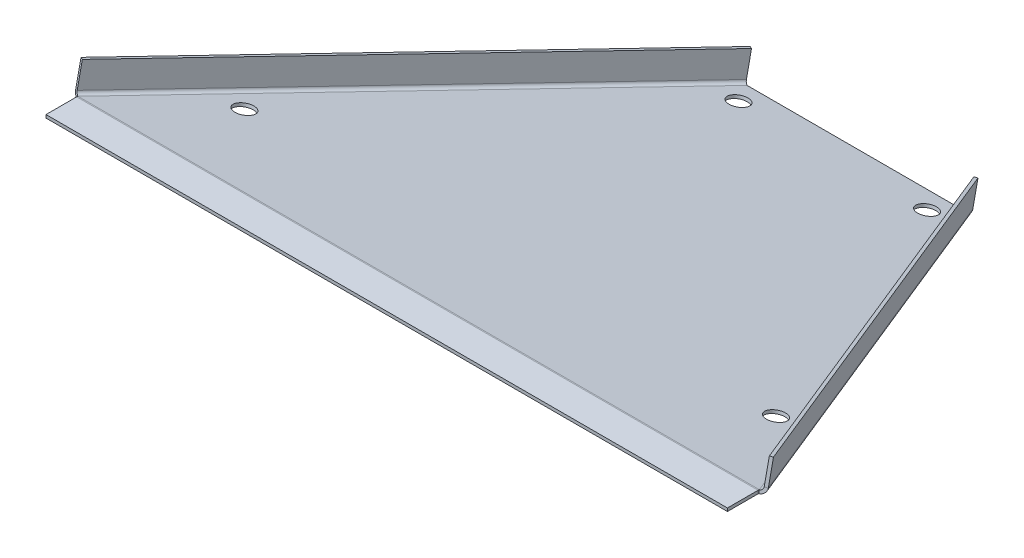
ISO-10303-21;
HEADER;
FILE_DESCRIPTION(('STEP AP214'),'2;1');
FILE_NAME('part.step','',(''),(''),'','','');
FILE_SCHEMA(('AUTOMOTIVE_DESIGN { 1 0 10303 214 1 1 1 1 }'));
ENDSEC;
DATA;
#1=APPLICATION_CONTEXT('core data for automotive mechanical design processes');
#2=APPLICATION_PROTOCOL_DEFINITION('international standard','automotive_design',2000,#1);
#3=PRODUCT_CONTEXT('',#1,'mechanical');
#4=PRODUCT('Part','Part','',(#3));
#5=PRODUCT_RELATED_PRODUCT_CATEGORY('part','',(#4));
#6=PRODUCT_DEFINITION_FORMATION('','',#4);
#7=PRODUCT_DEFINITION_CONTEXT('part definition',#1,'design');
#8=PRODUCT_DEFINITION('design','',#6,#7);
#9=PRODUCT_DEFINITION_SHAPE('','',#8);
#10=(LENGTH_UNIT() NAMED_UNIT(*) SI_UNIT(.MILLI.,.METRE.));
#11=(NAMED_UNIT(*) PLANE_ANGLE_UNIT() SI_UNIT($,.RADIAN.));
#12=(NAMED_UNIT(*) SI_UNIT($,.STERADIAN.) SOLID_ANGLE_UNIT());
#13=UNCERTAINTY_MEASURE_WITH_UNIT(LENGTH_MEASURE(1.E-05),#10,'distance_accuracy_value','');
#14=(GEOMETRIC_REPRESENTATION_CONTEXT(3) GLOBAL_UNCERTAINTY_ASSIGNED_CONTEXT((#13)) GLOBAL_UNIT_ASSIGNED_CONTEXT((#10,
#11,#12)) REPRESENTATION_CONTEXT('',''));
#15=CARTESIAN_POINT('',(0.,0.,0.));
#16=DIRECTION('',(0.,0.,1.));
#17=DIRECTION('',(1.,0.,0.));
#18=AXIS2_PLACEMENT_3D('',#15,#16,#17);
#19=CARTESIAN_POINT('',(-279.4,104.14,477.723454365452));
#20=DIRECTION('',(1.,0.,0.));
#21=DIRECTION('',(0.,0.,1.));
#22=AXIS2_PLACEMENT_3D('',#19,#20,#21);
#23=PLANE('',#22);
#24=DIRECTION('',(0.,1.,0.));
#25=VECTOR('',#24,1.);
#26=CARTESIAN_POINT('',(-279.4,104.14,478.257383880602));
#27=LINE('',#26,#25);
#28=CARTESIAN_POINT('',(-279.4,101.6,478.257383880602));
#29=VERTEX_POINT('',#28);
#30=CARTESIAN_POINT('',(-279.4,104.14,478.257383880602));
#31=VERTEX_POINT('',#30);
#32=EDGE_CURVE('E13',#29,#31,#27,.T.);
#33=ORIENTED_EDGE('',*,*,#32,.F.);
#34=DIRECTION('',(0.,0.,-1.));
#35=VECTOR('',#34,1.);
#36=CARTESIAN_POINT('',(-279.4,101.6,477.723454365452));
#37=LINE('',#36,#35);
#38=CARTESIAN_POINT('',(-279.4,101.6,503.390419123027));
#39=VERTEX_POINT('',#38);
#40=EDGE_CURVE('E131',#29,#39,#37,.F.);
#41=ORIENTED_EDGE('',*,*,#40,.T.);
#42=DIRECTION('',(0.,1.,0.));
#43=VECTOR('',#42,1.);
#44=CARTESIAN_POINT('',(-279.4,104.14,503.390419123027));
#45=LINE('',#44,#43);
#46=CARTESIAN_POINT('',(-279.4,104.14,503.390419123027));
#47=VERTEX_POINT('',#46);
#48=EDGE_CURVE('E88',#39,#47,#45,.T.);
#49=ORIENTED_EDGE('',*,*,#48,.T.);
#50=DIRECTION('',(0.,0.,1.));
#51=VECTOR('',#50,1.);
#52=CARTESIAN_POINT('',(-279.4,104.14,477.723454365452));
#53=LINE('',#52,#51);
#54=EDGE_CURVE('E133',#31,#47,#53,.T.);
#55=ORIENTED_EDGE('',*,*,#54,.F.);
#56=EDGE_LOOP('',(#33,#41,#49,#55));
#57=FACE_BOUND('',#56,.T.);
#58=ADVANCED_FACE('F79',(#57),#23,.F.);
#59=CARTESIAN_POINT('',(279.4,104.14,503.390419123027));
#60=DIRECTION('',(0.,0.,1.));
#61=DIRECTION('',(-1.,0.,0.));
#62=AXIS2_PLACEMENT_3D('',#59,#60,#61);
#63=PLANE('',#62);
#64=ORIENTED_EDGE('',*,*,#48,.F.);
#65=DIRECTION('',(1.,0.,0.));
#66=VECTOR('',#65,1.);
#67=CARTESIAN_POINT('',(279.4,101.6,503.390419123027));
#68=LINE('',#67,#66);
#69=CARTESIAN_POINT('',(279.4,101.6,503.390419123027));
#70=VERTEX_POINT('',#69);
#71=EDGE_CURVE('E158',#70,#39,#68,.F.);
#72=ORIENTED_EDGE('',*,*,#71,.F.);
#73=DIRECTION('',(0.,1.,0.));
#74=VECTOR('',#73,1.);
#75=CARTESIAN_POINT('',(279.4,104.14,503.390419123027));
#76=LINE('',#75,#74);
#77=CARTESIAN_POINT('',(279.4,104.14,503.390419123027));
#78=VERTEX_POINT('',#77);
#79=EDGE_CURVE('E174',#70,#78,#76,.T.);
#80=ORIENTED_EDGE('',*,*,#79,.T.);
#81=DIRECTION('',(-1.,0.,0.));
#82=VECTOR('',#81,1.);
#83=CARTESIAN_POINT('',(279.4,104.14,503.390419123027));
#84=LINE('',#83,#82);
#85=EDGE_CURVE('E315',#78,#47,#84,.T.);
#86=ORIENTED_EDGE('',*,*,#85,.T.);
#87=EDGE_LOOP('',(#64,#72,#80,#86));
#88=FACE_BOUND('',#87,.T.);
#89=ADVANCED_FACE('F336',(#88),#63,.T.);
#90=CARTESIAN_POINT('',(279.4,104.14,477.723454365452));
#91=DIRECTION('',(1.,0.,0.));
#92=DIRECTION('',(0.,0.,1.));
#93=AXIS2_PLACEMENT_3D('',#90,#91,#92);
#94=PLANE('',#93);
#95=ORIENTED_EDGE('',*,*,#79,.F.);
#96=DIRECTION('',(0.,0.,-1.));
#97=VECTOR('',#96,1.);
#98=CARTESIAN_POINT('',(279.4,101.6,477.723454365452));
#99=LINE('',#98,#97);
#100=CARTESIAN_POINT('',(279.4,101.6,478.257383880602));
#101=VERTEX_POINT('',#100);
#102=EDGE_CURVE('E333',#101,#70,#99,.F.);
#103=ORIENTED_EDGE('',*,*,#102,.F.);
#104=DIRECTION('',(0.,1.,0.));
#105=VECTOR('',#104,1.);
#106=CARTESIAN_POINT('',(279.4,104.14,478.257383880602));
#107=LINE('',#106,#105);
#108=CARTESIAN_POINT('',(279.4,104.14,478.257383880602));
#109=VERTEX_POINT('',#108);
#110=EDGE_CURVE('E105',#101,#109,#107,.T.);
#111=ORIENTED_EDGE('',*,*,#110,.T.);
#112=DIRECTION('',(0.,0.,1.));
#113=VECTOR('',#112,1.);
#114=CARTESIAN_POINT('',(279.4,104.14,477.723454365452));
#115=LINE('',#114,#113);
#116=EDGE_CURVE('E319',#109,#78,#115,.T.);
#117=ORIENTED_EDGE('',*,*,#116,.T.);
#118=EDGE_LOOP('',(#95,#103,#111,#117));
#119=FACE_BOUND('',#118,.T.);
#120=ADVANCED_FACE('F441',(#119),#94,.T.);
#121=CARTESIAN_POINT('',(279.4,99.0599999999999,478.257383880602));
#122=DIRECTION('',(-1.,0.,0.));
#123=DIRECTION('',(0.,0.,1.));
#124=AXIS2_PLACEMENT_3D('',#121,#122,#123);
#125=PLANE('',#124);
#126=ORIENTED_EDGE('',*,*,#110,.F.);
#127=CARTESIAN_POINT('',(279.4,99.0599999999999,478.257383880602));
#128=DIRECTION('',(-1.,0.,0.));
#129=DIRECTION('',(0.,0.,1.));
#130=AXIS2_PLACEMENT_3D('',#127,#128,#129);
#131=CIRCLE('',#130,2.54);
#132=CARTESIAN_POINT('',(279.4,101.544494905864,477.729288185925));
#133=VERTEX_POINT('',#132);
#134=EDGE_CURVE('E149',#101,#133,#131,.T.);
#135=ORIENTED_EDGE('',*,*,#134,.T.);
#136=DIRECTION('',(0.,0.978147600733807,-0.207911690817753));
#137=VECTOR('',#136,1.);
#138=CARTESIAN_POINT('',(279.4,104.028989811728,477.201192491248));
#139=LINE('',#138,#137);
#140=CARTESIAN_POINT('',(279.4,104.028989811728,477.201192491248));
#141=VERTEX_POINT('',#140);
#142=EDGE_CURVE('E170',#133,#141,#139,.T.);
#143=ORIENTED_EDGE('',*,*,#142,.T.);
#144=CARTESIAN_POINT('',(279.4,99.0599999999999,478.257383880602));
#145=DIRECTION('',(1.,0.,0.));
#146=DIRECTION('',(0.,0.,-1.));
#147=AXIS2_PLACEMENT_3D('',#144,#145,#146);
#148=CIRCLE('',#147,5.08);
#149=EDGE_CURVE('E316',#109,#141,#148,.F.);
#150=ORIENTED_EDGE('',*,*,#149,.F.);
#151=EDGE_LOOP('',(#126,#135,#143,#150));
#152=FACE_BOUND('',#151,.T.);
#153=ADVANCED_FACE('F446',(#152),#125,.F.);
#154=CARTESIAN_POINT('',(279.4,27.8844949058641,118.969509086081));
#155=DIRECTION('',(0.,0.207911690817753,0.978147600733807));
#156=DIRECTION('',(-1.,0.,0.));
#157=AXIS2_PLACEMENT_3D('',#154,#155,#156);
#158=PLANE('',#157);
#159=DIRECTION('',(0.,0.978147600733807,-0.207911690817753));
#160=VECTOR('',#159,1.);
#161=CARTESIAN_POINT('',(88.9,-52.6716373032427,136.092243569897));
#162=LINE('',#161,#160);
#163=CARTESIAN_POINT('',(88.9000000000001,25.4000000000033,119.49760478077));
#164=VERTEX_POINT('',#163);
#165=CARTESIAN_POINT('',(88.9,27.8844949058668,118.969509086093));
#166=VERTEX_POINT('',#165);
#167=EDGE_CURVE('E305',#164,#166,#162,.T.);
#168=ORIENTED_EDGE('',*,*,#167,.F.);
#169=DIRECTION('',(1.,0.,0.));
#170=VECTOR('',#169,1.);
#171=CARTESIAN_POINT('',(279.4,25.4000000000002,119.497604780758));
#172=LINE('',#171,#170);
#173=CARTESIAN_POINT('',(-88.8999999999998,25.4000000000002,119.497604780758));
#174=VERTEX_POINT('',#173);
#175=EDGE_CURVE('E153',#164,#174,#172,.F.);
#176=ORIENTED_EDGE('',*,*,#175,.T.);
#177=DIRECTION('',(0.,0.978147600733807,-0.207911690817753));
#178=VECTOR('',#177,1.);
#179=CARTESIAN_POINT('',(-88.9,-52.6716373032454,136.092243569884));
#180=LINE('',#179,#178);
#181=CARTESIAN_POINT('',(-88.9,27.8844949058641,118.969509086081));
#182=VERTEX_POINT('',#181);
#183=EDGE_CURVE('E306',#174,#182,#180,.T.);
#184=ORIENTED_EDGE('',*,*,#183,.T.);
#185=DIRECTION('',(-1.,0.,0.));
#186=VECTOR('',#185,1.);
#187=CARTESIAN_POINT('',(279.4,27.8844949058641,118.969509086081));
#188=LINE('',#187,#186);
#189=EDGE_CURVE('E321',#166,#182,#188,.T.);
#190=ORIENTED_EDGE('',*,*,#189,.F.);
#191=EDGE_LOOP('',(#168,#176,#184,#190));
#192=FACE_BOUND('',#191,.T.);
#193=ADVANCED_FACE('F449',(#192),#158,.F.);
#194=CARTESIAN_POINT('',(-279.4,99.0599999999999,478.257383880602));
#195=DIRECTION('',(1.,0.,0.));
#196=DIRECTION('',(0.,0.,-1.));
#197=AXIS2_PLACEMENT_3D('',#194,#195,#196);
#198=PLANE('',#197);
#199=CARTESIAN_POINT('',(-279.4,99.0599999999999,478.257383880602));
#200=DIRECTION('',(-1.,0.,0.));
#201=DIRECTION('',(0.,0.,1.));
#202=AXIS2_PLACEMENT_3D('',#199,#200,#201);
#203=CIRCLE('',#202,2.54);
#204=CARTESIAN_POINT('',(-279.4,101.544494905864,477.729288185925));
#205=VERTEX_POINT('',#204);
#206=EDGE_CURVE('E147',#205,#29,#203,.F.);
#207=ORIENTED_EDGE('',*,*,#206,.T.);
#208=ORIENTED_EDGE('',*,*,#32,.T.);
#209=CARTESIAN_POINT('',(-279.4,99.0599999999999,478.257383880602));
#210=DIRECTION('',(-1.,0.,0.));
#211=DIRECTION('',(0.,0.,1.));
#212=AXIS2_PLACEMENT_3D('',#209,#210,#211);
#213=CIRCLE('',#212,5.08);
#214=CARTESIAN_POINT('',(-279.4,104.028989811728,477.201192491248));
#215=VERTEX_POINT('',#214);
#216=EDGE_CURVE('E328',#215,#31,#213,.F.);
#217=ORIENTED_EDGE('',*,*,#216,.F.);
#218=DIRECTION('',(0.,0.978147600733806,-0.207911690817755));
#219=VECTOR('',#218,1.);
#220=CARTESIAN_POINT('',(-279.4,104.028989811728,477.201192491248));
#221=LINE('',#220,#219);
#222=EDGE_CURVE('E162',#205,#215,#221,.T.);
#223=ORIENTED_EDGE('',*,*,#222,.F.);
#224=EDGE_LOOP('',(#207,#208,#217,#223));
#225=FACE_BOUND('',#224,.T.);
#226=ADVANCED_FACE('F81',(#225),#198,.F.);
#227=CARTESIAN_POINT('',(279.4,104.14,477.723454365452));
#228=DIRECTION('',(0.,-0.978147600733807,0.207911690817753));
#229=DIRECTION('',(0.,-0.207911690817753,-0.978147600733807));
#230=AXIS2_PLACEMENT_3D('',#227,#228,#229);
#231=PLANE('',#230);
#232=CARTESIAN_POINT('',(-217.989950501464,88.0658183125369,402.100375213384));
#233=DIRECTION('',(0.,-0.978147600733807,0.207911690817753));
#234=DIRECTION('',(0.,-0.207911690817753,-0.978147600733807));
#235=AXIS2_PLACEMENT_3D('',#232,#233,#234);
#236=CIRCLE('',#235,7.93749999999997);
#237=CARTESIAN_POINT('',(-217.989950501464,86.415519266671,394.336328632559));
#238=VERTEX_POINT('',#237);
#239=EDGE_CURVE('E184',#238,#238,#236,.F.);
#240=ORIENTED_EDGE('',*,*,#239,.F.);
#241=EDGE_LOOP('',(#240));
#242=FACE_BOUND('',#241,.T.);
#243=CARTESIAN_POINT('',(-77.3359820374033,31.845212615945,137.603220880073));
#244=DIRECTION('',(0.,-0.978147600733807,0.207911690817753));
#245=DIRECTION('',(0.,-0.207911690817753,-0.978147600733807));
#246=AXIS2_PLACEMENT_3D('',#243,#244,#245);
#247=CIRCLE('',#246,7.93749999999998);
#248=CARTESIAN_POINT('',(-77.3359820374033,30.1949135700791,129.839174299248));
#249=VERTEX_POINT('',#248);
#250=EDGE_CURVE('E190',#249,#249,#247,.F.);
#251=ORIENTED_EDGE('',*,*,#250,.F.);
#252=EDGE_LOOP('',(#251));
#253=FACE_BOUND('',#252,.T.);
#254=CARTESIAN_POINT('',(217.989950501464,88.0658183125369,402.100375213384));
#255=DIRECTION('',(0.,-0.978147600733807,0.207911690817753));
#256=DIRECTION('',(0.,-0.207911690817753,-0.978147600733807));
#257=AXIS2_PLACEMENT_3D('',#254,#255,#256);
#258=CIRCLE('',#257,7.93749999999997);
#259=CARTESIAN_POINT('',(217.989950501464,86.415519266671,394.336328632559));
#260=VERTEX_POINT('',#259);
#261=EDGE_CURVE('E187',#260,#260,#258,.T.);
#262=ORIENTED_EDGE('',*,*,#261,.T.);
#263=EDGE_LOOP('',(#262));
#264=FACE_BOUND('',#263,.T.);
#265=CARTESIAN_POINT('',(77.3359820374033,31.845212615945,137.603220880073));
#266=DIRECTION('',(0.,-0.978147600733807,0.207911690817753));
#267=DIRECTION('',(0.,-0.207911690817753,-0.978147600733807));
#268=AXIS2_PLACEMENT_3D('',#265,#266,#267);
#269=CIRCLE('',#268,7.93749999999998);
#270=CARTESIAN_POINT('',(77.3359820374033,30.1949135700791,129.839174299248));
#271=VERTEX_POINT('',#270);
#272=EDGE_CURVE('E183',#271,#271,#269,.T.);
#273=ORIENTED_EDGE('',*,*,#272,.T.);
#274=EDGE_LOOP('',(#273));
#275=FACE_BOUND('',#274,.T.);
#276=DIRECTION('',(-1.,0.,0.));
#277=VECTOR('',#276,1.);
#278=CARTESIAN_POINT('',(279.4,104.028989811728,477.201192491248));
#279=LINE('',#278,#277);
#280=EDGE_CURVE('E179',#215,#141,#279,.F.);
#281=ORIENTED_EDGE('',*,*,#280,.T.);
#282=DIRECTION('',(0.461463151128806,0.184450806091181,0.867772816054171));
#283=VECTOR('',#282,1.);
#284=CARTESIAN_POINT('',(279.4,104.028989811728,477.201192491248));
#285=LINE('',#284,#283);
#286=EDGE_CURVE('E302',#166,#141,#285,.T.);
#287=ORIENTED_EDGE('',*,*,#286,.F.);
#288=ORIENTED_EDGE('',*,*,#189,.T.);
#289=DIRECTION('',(0.461463151128794,-0.184450806091182,-0.867772816054177));
#290=VECTOR('',#289,1.);
#291=CARTESIAN_POINT('',(-88.9,27.8844949058641,118.969509086081));
#292=LINE('',#291,#290);
#293=EDGE_CURVE('E293',#215,#182,#292,.T.);
#294=ORIENTED_EDGE('',*,*,#293,.F.);
#295=EDGE_LOOP('',(#281,#287,#288,#294));
#296=FACE_BOUND('',#295,.T.);
#297=ADVANCED_FACE('F465',(#242,#253,#264,#275,#296),#231,.F.);
#298=CARTESIAN_POINT('',(279.4,104.14,477.723454365452));
#299=DIRECTION('',(0.,-1.,0.));
#300=DIRECTION('',(0.,0.,-1.));
#301=AXIS2_PLACEMENT_3D('',#298,#299,#300);
#302=PLANE('',#301);
#303=ORIENTED_EDGE('',*,*,#116,.F.);
#304=DIRECTION('',(-1.,0.,0.));
#305=VECTOR('',#304,1.);
#306=CARTESIAN_POINT('',(279.4,104.14,478.257383880602));
#307=LINE('',#306,#305);
#308=EDGE_CURVE('E324',#109,#31,#307,.T.);
#309=ORIENTED_EDGE('',*,*,#308,.T.);
#310=ORIENTED_EDGE('',*,*,#54,.T.);
#311=ORIENTED_EDGE('',*,*,#85,.F.);
#312=EDGE_LOOP('',(#303,#309,#310,#311));
#313=FACE_BOUND('',#312,.T.);
#314=ADVANCED_FACE('F340',(#313),#302,.F.);
#315=CARTESIAN_POINT('',(279.4,99.0599999999999,478.257383880602));
#316=DIRECTION('',(-1.,0.,0.));
#317=DIRECTION('',(0.,0.,1.));
#318=AXIS2_PLACEMENT_3D('',#315,#316,#317);
#319=CYLINDRICAL_SURFACE('',#318,5.08);
#320=ORIENTED_EDGE('',*,*,#149,.T.);
#321=ORIENTED_EDGE('',*,*,#280,.F.);
#322=ORIENTED_EDGE('',*,*,#216,.T.);
#323=ORIENTED_EDGE('',*,*,#308,.F.);
#324=EDGE_LOOP('',(#320,#321,#322,#323));
#325=FACE_BOUND('',#324,.T.);
#326=ADVANCED_FACE('F344',(#325),#319,.T.);
#327=CARTESIAN_POINT('',(279.4,101.655505094136,478.251550060129));
#328=DIRECTION('',(0.,-0.978147600733807,0.207911690817753));
#329=DIRECTION('',(0.,-0.207911690817753,-0.978147600733807));
#330=AXIS2_PLACEMENT_3D('',#327,#328,#329);
#331=PLANE('',#330);
#332=CARTESIAN_POINT('',(-217.989950501464,85.581323406673,402.628470908061));
#333=DIRECTION('',(0.,-0.978147600733807,0.207911690817753));
#334=DIRECTION('',(0.,-0.207911690817753,-0.978147600733807));
#335=AXIS2_PLACEMENT_3D('',#332,#333,#334);
#336=CIRCLE('',#335,7.93749999999997);
#337=CARTESIAN_POINT('',(-217.989950501464,83.9310243608071,394.864424327236));
#338=VERTEX_POINT('',#337);
#339=EDGE_CURVE('E83',#338,#338,#336,.F.);
#340=ORIENTED_EDGE('',*,*,#339,.T.);
#341=EDGE_LOOP('',(#340));
#342=FACE_BOUND('',#341,.T.);
#343=CARTESIAN_POINT('',(-77.3359820374033,29.3607177100811,138.13131657475));
#344=DIRECTION('',(0.,-0.978147600733807,0.207911690817753));
#345=DIRECTION('',(0.,-0.207911690817753,-0.978147600733807));
#346=AXIS2_PLACEMENT_3D('',#343,#344,#345);
#347=CIRCLE('',#346,7.93749999999998);
#348=CARTESIAN_POINT('',(-77.3359820374033,27.7104186642152,130.367269993925));
#349=VERTEX_POINT('',#348);
#350=EDGE_CURVE('E188',#349,#349,#347,.F.);
#351=ORIENTED_EDGE('',*,*,#350,.T.);
#352=EDGE_LOOP('',(#351));
#353=FACE_BOUND('',#352,.T.);
#354=CARTESIAN_POINT('',(217.989950501464,85.581323406673,402.628470908061));
#355=DIRECTION('',(0.,-0.978147600733807,0.207911690817753));
#356=DIRECTION('',(0.,-0.207911690817753,-0.978147600733807));
#357=AXIS2_PLACEMENT_3D('',#354,#355,#356);
#358=CIRCLE('',#357,7.93749999999997);
#359=CARTESIAN_POINT('',(217.989950501464,83.9310243608071,394.864424327236));
#360=VERTEX_POINT('',#359);
#361=EDGE_CURVE('E185',#360,#360,#358,.T.);
#362=ORIENTED_EDGE('',*,*,#361,.F.);
#363=EDGE_LOOP('',(#362));
#364=FACE_BOUND('',#363,.T.);
#365=CARTESIAN_POINT('',(77.3359820374033,29.3607177100811,138.13131657475));
#366=DIRECTION('',(0.,-0.978147600733807,0.207911690817753));
#367=DIRECTION('',(0.,-0.207911690817753,-0.978147600733807));
#368=AXIS2_PLACEMENT_3D('',#365,#366,#367);
#369=CIRCLE('',#368,7.93749999999998);
#370=CARTESIAN_POINT('',(77.3359820374033,27.7104186642152,130.367269993925));
#371=VERTEX_POINT('',#370);
#372=EDGE_CURVE('E180',#371,#371,#369,.T.);
#373=ORIENTED_EDGE('',*,*,#372,.F.);
#374=EDGE_LOOP('',(#373));
#375=FACE_BOUND('',#374,.T.);
#376=DIRECTION('',(-0.461463151128806,-0.184450806091181,-0.867772816054171));
#377=VECTOR('',#376,1.);
#378=CARTESIAN_POINT('',(279.618586131233,101.631865669938,478.140335313277));
#379=LINE('',#378,#377);
#380=EDGE_CURVE('E163',#133,#164,#379,.T.);
#381=ORIENTED_EDGE('',*,*,#380,.F.);
#382=DIRECTION('',(1.,0.,0.));
#383=VECTOR('',#382,1.);
#384=CARTESIAN_POINT('',(279.4,101.544494905864,477.729288185925));
#385=LINE('',#384,#383);
#386=EDGE_CURVE('E152',#205,#133,#385,.T.);
#387=ORIENTED_EDGE('',*,*,#386,.F.);
#388=DIRECTION('',(-0.461463151128794,0.184450806091182,0.867772816054177));
#389=VECTOR('',#388,1.);
#390=CARTESIAN_POINT('',(-160.623109703212,54.0683462542201,254.371569757319));
#391=LINE('',#390,#389);
#392=EDGE_CURVE('E96',#174,#205,#391,.T.);
#393=ORIENTED_EDGE('',*,*,#392,.F.);
#394=ORIENTED_EDGE('',*,*,#175,.F.);
#395=EDGE_LOOP('',(#381,#387,#393,#394));
#396=FACE_BOUND('',#395,.T.);
#397=ADVANCED_FACE('F459',(#342,#353,#364,#375,#396),#331,.T.);
#398=CARTESIAN_POINT('',(279.4,101.6,477.723454365452));
#399=DIRECTION('',(0.,-1.,0.));
#400=DIRECTION('',(0.,0.,-1.));
#401=AXIS2_PLACEMENT_3D('',#398,#399,#400);
#402=PLANE('',#401);
#403=ORIENTED_EDGE('',*,*,#102,.T.);
#404=ORIENTED_EDGE('',*,*,#71,.T.);
#405=ORIENTED_EDGE('',*,*,#40,.F.);
#406=DIRECTION('',(1.,0.,0.));
#407=VECTOR('',#406,1.);
#408=CARTESIAN_POINT('',(279.4,101.6,478.257383880602));
#409=LINE('',#408,#407);
#410=EDGE_CURVE('E143',#101,#29,#409,.F.);
#411=ORIENTED_EDGE('',*,*,#410,.F.);
#412=EDGE_LOOP('',(#403,#404,#405,#411));
#413=FACE_BOUND('',#412,.T.);
#414=ADVANCED_FACE('F156',(#413),#402,.T.);
#415=CARTESIAN_POINT('',(279.4,99.0599999999999,478.257383880602));
#416=DIRECTION('',(-1.,0.,0.));
#417=DIRECTION('',(0.,0.,1.));
#418=AXIS2_PLACEMENT_3D('',#415,#416,#417);
#419=CYLINDRICAL_SURFACE('',#418,2.54);
#420=ORIENTED_EDGE('',*,*,#134,.F.);
#421=ORIENTED_EDGE('',*,*,#410,.T.);
#422=ORIENTED_EDGE('',*,*,#206,.F.);
#423=ORIENTED_EDGE('',*,*,#386,.T.);
#424=EDGE_LOOP('',(#420,#421,#422,#423));
#425=FACE_BOUND('',#424,.T.);
#426=ADVANCED_FACE('F144',(#425),#419,.F.);
#427=CARTESIAN_POINT('',(279.4,106.513484717591,476.673096796571));
#428=DIRECTION('',(0.461463151128807,0.184450806091179,0.867772816054171));
#429=DIRECTION('',(0.88292221864253,0.,-0.469519281635327));
#430=AXIS2_PLACEMENT_3D('',#427,#428,#429);
#431=PLANE('',#430);
#432=DIRECTION('',(-0.887159376972521,0.0959435840012815,0.451379074103704));
#433=VECTOR('',#432,1.);
#434=CARTESIAN_POINT('',(283.90676963502,106.026091310865,474.380091100124));
#435=LINE('',#434,#433);
#436=CARTESIAN_POINT('',(281.65338481751,106.269788014228,475.526593948347));
#437=VERTEX_POINT('',#436);
#438=CARTESIAN_POINT('',(283.90676963502,106.026091310865,474.380091100124));
#439=VERTEX_POINT('',#438);
#440=EDGE_CURVE('E245',#437,#439,#435,.F.);
#441=ORIENTED_EDGE('',*,*,#440,.F.);
#442=CARTESIAN_POINT('',(279.4,106.513484717591,476.673096796571));
#443=DIRECTION('',(-0.461463151128807,-0.184450806091179,-0.867772816054171));
#444=DIRECTION('',(-0.88292221864253,0.,0.469519281635327));
#445=AXIS2_PLACEMENT_3D('',#442,#443,#444);
#446=CIRCLE('',#445,2.53999999999993);
#447=EDGE_CURVE('E297',#141,#437,#446,.F.);
#448=ORIENTED_EDGE('',*,*,#447,.F.);
#449=ORIENTED_EDGE('',*,*,#142,.F.);
#450=CARTESIAN_POINT('',(279.4,106.513484717591,476.673096796571));
#451=DIRECTION('',(-0.461463151128807,-0.184450806091179,-0.867772816054171));
#452=DIRECTION('',(-0.88292221864253,0.,0.469519281635327));
#453=AXIS2_PLACEMENT_3D('',#450,#451,#452);
#454=CIRCLE('',#453,5.07999999999993);
#455=EDGE_CURVE('E290',#133,#439,#454,.F.);
#456=ORIENTED_EDGE('',*,*,#455,.T.);
#457=EDGE_LOOP('',(#441,#448,#449,#456));
#458=FACE_BOUND('',#457,.T.);
#459=ADVANCED_FACE('F456',(#458),#431,.T.);
#460=CARTESIAN_POINT('',(88.8999999999999,30.368989811731,118.441413391416));
#461=DIRECTION('',(0.461463151128807,0.184450806091179,0.867772816054171));
#462=DIRECTION('',(0.88292221864253,0.,-0.469519281635327));
#463=AXIS2_PLACEMENT_3D('',#460,#461,#462);
#464=PLANE('',#463);
#465=CARTESIAN_POINT('',(88.8999999999999,30.368989811731,118.441413391416));
#466=DIRECTION('',(-0.461463151128807,-0.184450806091179,-0.867772816054171));
#467=DIRECTION('',(-0.88292221864253,0.,0.469519281635327));
#468=AXIS2_PLACEMENT_3D('',#465,#466,#467);
#469=CIRCLE('',#468,2.53999999999993);
#470=CARTESIAN_POINT('',(91.1533848175101,30.1252931083678,117.294910543193));
#471=VERTEX_POINT('',#470);
#472=EDGE_CURVE('E257',#471,#166,#469,.T.);
#473=ORIENTED_EDGE('',*,*,#472,.F.);
#474=DIRECTION('',(-0.887159376972521,0.0959435840012815,0.451379074103704));
#475=VECTOR('',#474,1.);
#476=CARTESIAN_POINT('',(91.1533848175102,30.1252931083675,117.294910543193));
#477=LINE('',#476,#475);
#478=CARTESIAN_POINT('',(93.4067696350204,29.8815964050043,116.148407694969));
#479=VERTEX_POINT('',#478);
#480=EDGE_CURVE('E282',#471,#479,#477,.F.);
#481=ORIENTED_EDGE('',*,*,#480,.T.);
#482=CARTESIAN_POINT('',(88.8999999999999,30.368989811731,118.441413391416));
#483=DIRECTION('',(-0.461463151128807,-0.184450806091179,-0.867772816054171));
#484=DIRECTION('',(-0.88292221864253,0.,0.469519281635327));
#485=AXIS2_PLACEMENT_3D('',#482,#483,#484);
#486=CIRCLE('',#485,5.07999999999993);
#487=EDGE_CURVE('E294',#479,#164,#486,.T.);
#488=ORIENTED_EDGE('',*,*,#487,.T.);
#489=ORIENTED_EDGE('',*,*,#167,.T.);
#490=EDGE_LOOP('',(#473,#481,#488,#489));
#491=FACE_BOUND('',#490,.T.);
#492=ADVANCED_FACE('F471',(#491),#464,.F.);
#493=CARTESIAN_POINT('',(88.8999999999999,30.368989811731,118.441413391416));
#494=DIRECTION('',(-0.461463151128807,-0.184450806091179,-0.867772816054171));
#495=DIRECTION('',(0.887159376972521,-0.0959435840012816,-0.451379074103704));
#496=AXIS2_PLACEMENT_3D('',#493,#494,#495);
#497=CYLINDRICAL_SURFACE('',#496,5.07999999999993);
#498=ORIENTED_EDGE('',*,*,#380,.T.);
#499=ORIENTED_EDGE('',*,*,#487,.F.);
#500=DIRECTION('',(-0.461463151128806,-0.184450806091181,-0.867772816054171));
#501=VECTOR('',#500,1.);
#502=CARTESIAN_POINT('',(283.90676963502,106.026091310865,474.380091100124));
#503=LINE('',#502,#501);
#504=EDGE_CURVE('E279',#479,#439,#503,.F.);
#505=ORIENTED_EDGE('',*,*,#504,.T.);
#506=ORIENTED_EDGE('',*,*,#455,.F.);
#507=EDGE_LOOP('',(#498,#499,#505,#506));
#508=FACE_BOUND('',#507,.T.);
#509=ADVANCED_FACE('F474',(#508),#497,.T.);
#510=CARTESIAN_POINT('',(88.8999999999999,30.368989811731,118.441413391416));
#511=DIRECTION('',(-0.461463151128807,-0.184450806091179,-0.867772816054171));
#512=DIRECTION('',(0.887159376972521,-0.0959435840012816,-0.451379074103704));
#513=AXIS2_PLACEMENT_3D('',#510,#511,#512);
#514=CYLINDRICAL_SURFACE('',#513,2.53999999999993);
#515=ORIENTED_EDGE('',*,*,#286,.T.);
#516=ORIENTED_EDGE('',*,*,#447,.T.);
#517=DIRECTION('',(-0.461463151128806,-0.184450806091181,-0.867772816054171));
#518=VECTOR('',#517,1.);
#519=CARTESIAN_POINT('',(281.65338481751,106.269788014228,475.526593948347));
#520=LINE('',#519,#518);
#521=EDGE_CURVE('E285',#437,#471,#520,.T.);
#522=ORIENTED_EDGE('',*,*,#521,.T.);
#523=ORIENTED_EDGE('',*,*,#472,.T.);
#524=EDGE_LOOP('',(#515,#516,#522,#523));
#525=FACE_BOUND('',#524,.T.);
#526=ADVANCED_FACE('F479',(#525),#514,.F.);
#527=CARTESIAN_POINT('',(93.4067696350205,49.7575556519151,111.923642137553));
#528=DIRECTION('',(0.461463151128807,0.184450806091179,0.867772816054171));
#529=DIRECTION('',(0.88292221864253,0.,-0.469519281635326));
#530=AXIS2_PLACEMENT_3D('',#527,#528,#529);
#531=PLANE('',#530);
#532=ORIENTED_EDGE('',*,*,#480,.F.);
#533=DIRECTION('',(0.,-0.978147600733807,0.207911690817753));
#534=VECTOR('',#533,1.);
#535=CARTESIAN_POINT('',(91.1533848175103,50.0012523552784,113.070144985776));
#536=LINE('',#535,#534);
#537=CARTESIAN_POINT('',(91.1533848175103,50.0012523552784,113.070144985776));
#538=VERTEX_POINT('',#537);
#539=EDGE_CURVE('E276',#471,#538,#536,.F.);
#540=ORIENTED_EDGE('',*,*,#539,.T.);
#541=DIRECTION('',(-0.887159376972521,0.0959435840012816,0.451379074103704));
#542=VECTOR('',#541,1.);
#543=CARTESIAN_POINT('',(93.4067696350205,49.7575556519152,111.923642137553));
#544=LINE('',#543,#542);
#545=CARTESIAN_POINT('',(93.4067696350205,49.7575556519152,111.923642137553));
#546=VERTEX_POINT('',#545);
#547=EDGE_CURVE('E254',#546,#538,#544,.T.);
#548=ORIENTED_EDGE('',*,*,#547,.F.);
#549=DIRECTION('',(0.,0.978147600733807,-0.207911690817753));
#550=VECTOR('',#549,1.);
#551=CARTESIAN_POINT('',(93.4067696350204,24.9126065932761,117.204599084324));
#552=LINE('',#551,#550);
#553=EDGE_CURVE('E267',#479,#546,#552,.T.);
#554=ORIENTED_EDGE('',*,*,#553,.F.);
#555=EDGE_LOOP('',(#532,#540,#548,#554));
#556=FACE_BOUND('',#555,.T.);
#557=ADVANCED_FACE('F482',(#556),#531,.F.);
#558=CARTESIAN_POINT('',(283.90676963502,103.541596405001,474.908186794801));
#559=DIRECTION('',(-0.461463151128806,-0.184450806091184,-0.86777281605417));
#560=DIRECTION('',(-0.882922218642529,0.,0.469519281635327));
#561=AXIS2_PLACEMENT_3D('',#558,#559,#560);
#562=PLANE('',#561);
#563=ORIENTED_EDGE('',*,*,#440,.T.);
#564=DIRECTION('',(0.,-0.978147600733806,0.207911690817757));
#565=VECTOR('',#564,1.);
#566=CARTESIAN_POINT('',(283.90676963502,101.057101499139,475.436282489478));
#567=LINE('',#566,#565);
#568=CARTESIAN_POINT('',(283.90676963502,125.902050557776,470.155325542707));
#569=VERTEX_POINT('',#568);
#570=EDGE_CURVE('E261',#569,#439,#567,.T.);
#571=ORIENTED_EDGE('',*,*,#570,.F.);
#572=DIRECTION('',(-0.887159376972522,0.0959435840012816,0.451379074103704));
#573=VECTOR('',#572,1.);
#574=CARTESIAN_POINT('',(283.90676963502,125.902050557776,470.155325542707));
#575=LINE('',#574,#573);
#576=CARTESIAN_POINT('',(281.65338481751,126.145747261139,471.30182839093));
#577=VERTEX_POINT('',#576);
#578=EDGE_CURVE('E258',#569,#577,#575,.T.);
#579=ORIENTED_EDGE('',*,*,#578,.T.);
#580=DIRECTION('',(0.,0.978147600733806,-0.207911690817757));
#581=VECTOR('',#580,1.);
#582=CARTESIAN_POINT('',(281.65338481751,103.785293108365,476.054689643024));
#583=LINE('',#582,#581);
#584=EDGE_CURVE('E270',#577,#437,#583,.F.);
#585=ORIENTED_EDGE('',*,*,#584,.T.);
#586=EDGE_LOOP('',(#563,#571,#579,#585));
#587=FACE_BOUND('',#586,.T.);
#588=ADVANCED_FACE('F489',(#587),#562,.F.);
#589=CARTESIAN_POINT('',(24.4614533209575,-2.64543165795271,-12.4457774305718));
#590=DIRECTION('',(-0.887159376972521,0.0959435840012815,0.451379074103704));
#591=DIRECTION('',(0.453471038755339,0.,0.891271012100222));
#592=AXIS2_PLACEMENT_3D('',#589,#590,#591);
#593=PLANE('',#592);
#594=ORIENTED_EDGE('',*,*,#504,.F.);
#595=ORIENTED_EDGE('',*,*,#553,.T.);
#596=DIRECTION('',(0.461463151128806,0.184450806091181,0.867772816054171));
#597=VECTOR('',#596,1.);
#598=CARTESIAN_POINT('',(24.4614533209576,22.1995174006861,-17.7267343773428));
#599=LINE('',#598,#597);
#600=EDGE_CURVE('E264',#546,#569,#599,.T.);
#601=ORIENTED_EDGE('',*,*,#600,.T.);
#602=ORIENTED_EDGE('',*,*,#570,.T.);
#603=EDGE_LOOP('',(#594,#595,#601,#602));
#604=FACE_BOUND('',#603,.T.);
#605=ADVANCED_FACE('F498',(#604),#593,.F.);
#606=CARTESIAN_POINT('',(22.2080685034473,-2.40173495458945,-11.2992745823484));
#607=DIRECTION('',(-0.887159376972521,0.0959435840012815,0.451379074103704));
#608=DIRECTION('',(0.453471038755339,0.,0.891271012100222));
#609=AXIS2_PLACEMENT_3D('',#606,#607,#608);
#610=PLANE('',#609);
#611=ORIENTED_EDGE('',*,*,#539,.F.);
#612=ORIENTED_EDGE('',*,*,#521,.F.);
#613=ORIENTED_EDGE('',*,*,#584,.F.);
#614=DIRECTION('',(-0.461463151128806,-0.184450806091181,-0.867772816054171));
#615=VECTOR('',#614,1.);
#616=CARTESIAN_POINT('',(281.65338481751,126.145747261139,471.30182839093));
#617=LINE('',#616,#615);
#618=EDGE_CURVE('E273',#538,#577,#617,.F.);
#619=ORIENTED_EDGE('',*,*,#618,.F.);
#620=EDGE_LOOP('',(#611,#612,#613,#619));
#621=FACE_BOUND('',#620,.T.);
#622=ADVANCED_FACE('F494',(#621),#610,.T.);
#623=CARTESIAN_POINT('',(283.90676963502,125.902050557776,470.155325542707));
#624=DIRECTION('',(0.,-0.978147600733807,0.207911690817754));
#625=DIRECTION('',(0.,-0.207911690817754,-0.978147600733807));
#626=AXIS2_PLACEMENT_3D('',#623,#624,#625);
#627=PLANE('',#626);
#628=ORIENTED_EDGE('',*,*,#618,.T.);
#629=ORIENTED_EDGE('',*,*,#578,.F.);
#630=ORIENTED_EDGE('',*,*,#600,.F.);
#631=ORIENTED_EDGE('',*,*,#547,.T.);
#632=EDGE_LOOP('',(#628,#629,#630,#631));
#633=FACE_BOUND('',#632,.T.);
#634=ADVANCED_FACE('F491',(#633),#627,.F.);
#635=CARTESIAN_POINT('',(-88.9000000000001,30.368989811728,118.441413391403));
#636=DIRECTION('',(0.461463151128793,-0.184450806091182,-0.867772816054178));
#637=DIRECTION('',(-0.882922218642537,0.,-0.469519281635313));
#638=AXIS2_PLACEMENT_3D('',#635,#636,#637);
#639=PLANE('',#638);
#640=DIRECTION('',(0.887159376972528,0.0959435840012782,0.451379074103691));
#641=VECTOR('',#640,1.);
#642=CARTESIAN_POINT('',(-93.4067696350204,29.8815964050014,116.148407694957));
#643=LINE('',#642,#641);
#644=CARTESIAN_POINT('',(-91.1533848175101,30.1252931083648,117.29491054318));
#645=VERTEX_POINT('',#644);
#646=CARTESIAN_POINT('',(-93.4067696350202,29.8815964050015,116.148407694956));
#647=VERTEX_POINT('',#646);
#648=EDGE_CURVE('E205',#645,#647,#643,.F.);
#649=ORIENTED_EDGE('',*,*,#648,.F.);
#650=CARTESIAN_POINT('',(-88.9000000000001,30.368989811728,118.441413391403));
#651=DIRECTION('',(-0.461463151128793,0.184450806091182,0.867772816054178));
#652=DIRECTION('',(0.882922218642537,0.,0.469519281635313));
#653=AXIS2_PLACEMENT_3D('',#650,#651,#652);
#654=CIRCLE('',#653,2.53999999999979);
#655=EDGE_CURVE('E249',#182,#645,#654,.F.);
#656=ORIENTED_EDGE('',*,*,#655,.F.);
#657=ORIENTED_EDGE('',*,*,#183,.F.);
#658=CARTESIAN_POINT('',(-88.8999999999999,30.3689898117279,118.441413391403));
#659=DIRECTION('',(-0.461463151128793,0.184450806091182,0.867772816054178));
#660=DIRECTION('',(0.882922218642537,0.,0.469519281635313));
#661=AXIS2_PLACEMENT_3D('',#658,#659,#660);
#662=CIRCLE('',#661,5.07999999999979);
#663=EDGE_CURVE('E242',#174,#647,#662,.F.);
#664=ORIENTED_EDGE('',*,*,#663,.T.);
#665=EDGE_LOOP('',(#649,#656,#657,#664));
#666=FACE_BOUND('',#665,.T.);
#667=ADVANCED_FACE('F411',(#666),#639,.T.);
#668=CARTESIAN_POINT('',(-279.4,106.513484717591,476.673096796571));
#669=DIRECTION('',(0.461463151128793,-0.184450806091182,-0.867772816054178));
#670=DIRECTION('',(-0.882922218642537,0.,-0.469519281635313));
#671=AXIS2_PLACEMENT_3D('',#668,#669,#670);
#672=PLANE('',#671);
#673=CARTESIAN_POINT('',(-279.4,106.513484717591,476.673096796571));
#674=DIRECTION('',(-0.461463151128793,0.184450806091182,0.867772816054178));
#675=DIRECTION('',(0.882922218642537,0.,0.469519281635313));
#676=AXIS2_PLACEMENT_3D('',#673,#674,#675);
#677=CIRCLE('',#676,2.53999999999979);
#678=CARTESIAN_POINT('',(-281.65338481751,106.269788014228,475.526593948347));
#679=VERTEX_POINT('',#678);
#680=EDGE_CURVE('E209',#679,#215,#677,.T.);
#681=ORIENTED_EDGE('',*,*,#680,.F.);
#682=DIRECTION('',(0.887159376972528,0.0959435840012782,0.451379074103691));
#683=VECTOR('',#682,1.);
#684=CARTESIAN_POINT('',(-281.65338481751,106.269788014228,475.526593948347));
#685=LINE('',#684,#683);
#686=CARTESIAN_POINT('',(-283.90676963502,106.026091310865,474.380091100124));
#687=VERTEX_POINT('',#686);
#688=EDGE_CURVE('E234',#679,#687,#685,.F.);
#689=ORIENTED_EDGE('',*,*,#688,.T.);
#690=CARTESIAN_POINT('',(-279.4,106.513484717591,476.673096796571));
#691=DIRECTION('',(-0.461463151128793,0.184450806091182,0.867772816054178));
#692=DIRECTION('',(0.882922218642537,0.,0.469519281635313));
#693=AXIS2_PLACEMENT_3D('',#690,#691,#692);
#694=CIRCLE('',#693,5.07999999999979);
#695=EDGE_CURVE('E246',#687,#205,#694,.T.);
#696=ORIENTED_EDGE('',*,*,#695,.T.);
#697=ORIENTED_EDGE('',*,*,#222,.T.);
#698=EDGE_LOOP('',(#681,#689,#696,#697));
#699=FACE_BOUND('',#698,.T.);
#700=ADVANCED_FACE('F425',(#699),#672,.F.);
#701=CARTESIAN_POINT('',(-279.4,106.513484717591,476.673096796571));
#702=DIRECTION('',(-0.461463151128793,0.184450806091182,0.867772816054178));
#703=DIRECTION('',(-0.887159376972529,-0.0959435840012781,-0.45137907410369));
#704=AXIS2_PLACEMENT_3D('',#701,#702,#703);
#705=CYLINDRICAL_SURFACE('',#704,5.07999999999979);
#706=ORIENTED_EDGE('',*,*,#392,.T.);
#707=ORIENTED_EDGE('',*,*,#695,.F.);
#708=DIRECTION('',(-0.461463151128794,0.184450806091182,0.867772816054178));
#709=VECTOR('',#708,1.);
#710=CARTESIAN_POINT('',(-93.4067696350204,29.8815964050014,116.148407694957));
#711=LINE('',#710,#709);
#712=EDGE_CURVE('E231',#687,#647,#711,.F.);
#713=ORIENTED_EDGE('',*,*,#712,.T.);
#714=ORIENTED_EDGE('',*,*,#663,.F.);
#715=EDGE_LOOP('',(#706,#707,#713,#714));
#716=FACE_BOUND('',#715,.T.);
#717=ADVANCED_FACE('F427',(#716),#705,.T.);
#718=CARTESIAN_POINT('',(-279.4,106.513484717591,476.673096796571));
#719=DIRECTION('',(-0.461463151128793,0.184450806091182,0.867772816054178));
#720=DIRECTION('',(-0.887159376972529,-0.0959435840012781,-0.45137907410369));
#721=AXIS2_PLACEMENT_3D('',#718,#719,#720);
#722=CYLINDRICAL_SURFACE('',#721,2.53999999999979);
#723=ORIENTED_EDGE('',*,*,#293,.T.);
#724=ORIENTED_EDGE('',*,*,#655,.T.);
#725=DIRECTION('',(-0.461463151128794,0.184450806091182,0.867772816054178));
#726=VECTOR('',#725,1.);
#727=CARTESIAN_POINT('',(-91.1533848175102,30.1252931083647,117.29491054318));
#728=LINE('',#727,#726);
#729=EDGE_CURVE('E237',#645,#679,#728,.T.);
#730=ORIENTED_EDGE('',*,*,#729,.T.);
#731=ORIENTED_EDGE('',*,*,#680,.T.);
#732=EDGE_LOOP('',(#723,#724,#730,#731));
#733=FACE_BOUND('',#732,.T.);
#734=ADVANCED_FACE('F416',(#733),#722,.F.);
#735=CARTESIAN_POINT('',(-283.90676963502,125.902050557776,470.155325542707));
#736=DIRECTION('',(0.461463151128794,-0.184450806091187,-0.867772816054176));
#737=DIRECTION('',(-0.882922218642536,0.,-0.469519281635314));
#738=AXIS2_PLACEMENT_3D('',#735,#736,#737);
#739=PLANE('',#738);
#740=ORIENTED_EDGE('',*,*,#688,.F.);
#741=DIRECTION('',(0.,-0.978147600733806,0.207911690817758));
#742=VECTOR('',#741,1.);
#743=CARTESIAN_POINT('',(-281.65338481751,126.145747261139,471.30182839093));
#744=LINE('',#743,#742);
#745=CARTESIAN_POINT('',(-281.65338481751,126.145747261139,471.30182839093));
#746=VERTEX_POINT('',#745);
#747=EDGE_CURVE('E228',#679,#746,#744,.F.);
#748=ORIENTED_EDGE('',*,*,#747,.T.);
#749=DIRECTION('',(0.887159376972528,0.0959435840012789,0.451379074103691));
#750=VECTOR('',#749,1.);
#751=CARTESIAN_POINT('',(-283.90676963502,125.902050557776,470.155325542707));
#752=LINE('',#751,#750);
#753=CARTESIAN_POINT('',(-283.90676963502,125.902050557776,470.155325542707));
#754=VERTEX_POINT('',#753);
#755=EDGE_CURVE('E206',#754,#746,#752,.T.);
#756=ORIENTED_EDGE('',*,*,#755,.F.);
#757=DIRECTION('',(0.,0.978147600733806,-0.207911690817758));
#758=VECTOR('',#757,1.);
#759=CARTESIAN_POINT('',(-283.90676963502,101.05710149914,475.436282489477));
#760=LINE('',#759,#758);
#761=EDGE_CURVE('E219',#687,#754,#760,.T.);
#762=ORIENTED_EDGE('',*,*,#761,.F.);
#763=EDGE_LOOP('',(#740,#748,#756,#762));
#764=FACE_BOUND('',#763,.T.);
#765=ADVANCED_FACE('F423',(#764),#739,.F.);
#766=CARTESIAN_POINT('',(-93.4067696350204,27.3971014991376,116.676503389634));
#767=DIRECTION('',(-0.461463151128794,0.184450806091182,0.867772816054177));
#768=DIRECTION('',(0.882922218642537,0.,0.469519281635314));
#769=AXIS2_PLACEMENT_3D('',#766,#767,#768);
#770=PLANE('',#769);
#771=ORIENTED_EDGE('',*,*,#648,.T.);
#772=DIRECTION('',(0.,-0.978147600733807,0.207911690817754));
#773=VECTOR('',#772,1.);
#774=CARTESIAN_POINT('',(-93.4067696350204,24.9126065932736,117.204599084311));
#775=LINE('',#774,#773);
#776=CARTESIAN_POINT('',(-93.4067696350205,49.7575556519124,111.92364213754));
#777=VERTEX_POINT('',#776);
#778=EDGE_CURVE('E213',#777,#647,#775,.T.);
#779=ORIENTED_EDGE('',*,*,#778,.F.);
#780=DIRECTION('',(0.887159376972528,0.095943584001279,0.451379074103691));
#781=VECTOR('',#780,1.);
#782=CARTESIAN_POINT('',(-93.4067696350205,49.7575556519124,111.92364213754));
#783=LINE('',#782,#781);
#784=CARTESIAN_POINT('',(-91.1533848175103,50.0012523552757,113.070144985763));
#785=VERTEX_POINT('',#784);
#786=EDGE_CURVE('E210',#777,#785,#783,.T.);
#787=ORIENTED_EDGE('',*,*,#786,.T.);
#788=DIRECTION('',(0.,0.978147600733807,-0.207911690817754));
#789=VECTOR('',#788,1.);
#790=CARTESIAN_POINT('',(-91.1533848175102,27.6407982025008,117.823006237857));
#791=LINE('',#790,#789);
#792=EDGE_CURVE('E222',#785,#645,#791,.F.);
#793=ORIENTED_EDGE('',*,*,#792,.T.);
#794=EDGE_LOOP('',(#771,#779,#787,#793));
#795=FACE_BOUND('',#794,.T.);
#796=ADVANCED_FACE('F408',(#795),#770,.F.);
#797=CARTESIAN_POINT('',(-24.461453320965,-2.64543165795341,-12.4457774305752));
#798=DIRECTION('',(0.887159376972528,0.0959435840012783,0.451379074103691));
#799=DIRECTION('',(0.453471038755327,0.,-0.891271012100228));
#800=AXIS2_PLACEMENT_3D('',#797,#798,#799);
#801=PLANE('',#800);
#802=ORIENTED_EDGE('',*,*,#712,.F.);
#803=ORIENTED_EDGE('',*,*,#761,.T.);
#804=DIRECTION('',(0.461463151128794,-0.184450806091182,-0.867772816054177));
#805=VECTOR('',#804,1.);
#806=CARTESIAN_POINT('',(-24.461453320965,22.1995174006854,-17.7267343773462));
#807=LINE('',#806,#805);
#808=EDGE_CURVE('E216',#754,#777,#807,.T.);
#809=ORIENTED_EDGE('',*,*,#808,.T.);
#810=ORIENTED_EDGE('',*,*,#778,.T.);
#811=EDGE_LOOP('',(#802,#803,#809,#810));
#812=FACE_BOUND('',#811,.T.);
#813=ADVANCED_FACE('F399',(#812),#801,.F.);
#814=CARTESIAN_POINT('',(-22.2080685034548,-2.40173495459016,-11.2992745823518));
#815=DIRECTION('',(0.887159376972528,0.0959435840012783,0.451379074103691));
#816=DIRECTION('',(0.453471038755327,0.,-0.891271012100228));
#817=AXIS2_PLACEMENT_3D('',#814,#815,#816);
#818=PLANE('',#817);
#819=ORIENTED_EDGE('',*,*,#747,.F.);
#820=ORIENTED_EDGE('',*,*,#729,.F.);
#821=ORIENTED_EDGE('',*,*,#792,.F.);
#822=DIRECTION('',(-0.461463151128794,0.184450806091182,0.867772816054177));
#823=VECTOR('',#822,1.);
#824=CARTESIAN_POINT('',(-91.1533848175103,50.0012523552757,113.070144985763));
#825=LINE('',#824,#823);
#826=EDGE_CURVE('E225',#746,#785,#825,.F.);
#827=ORIENTED_EDGE('',*,*,#826,.F.);
#828=EDGE_LOOP('',(#819,#820,#821,#827));
#829=FACE_BOUND('',#828,.T.);
#830=ADVANCED_FACE('F420',(#829),#818,.T.);
#831=CARTESIAN_POINT('',(-93.4067696350205,49.7575556519124,111.92364213754));
#832=DIRECTION('',(0.,-0.978147600733807,0.207911690817754));
#833=DIRECTION('',(0.,-0.207911690817754,-0.978147600733807));
#834=AXIS2_PLACEMENT_3D('',#831,#832,#833);
#835=PLANE('',#834);
#836=ORIENTED_EDGE('',*,*,#826,.T.);
#837=ORIENTED_EDGE('',*,*,#786,.F.);
#838=ORIENTED_EDGE('',*,*,#808,.F.);
#839=ORIENTED_EDGE('',*,*,#755,.T.);
#840=EDGE_LOOP('',(#836,#837,#838,#839));
#841=FACE_BOUND('',#840,.T.);
#842=ADVANCED_FACE('F404',(#841),#835,.F.);
#843=CARTESIAN_POINT('',(77.3359820374033,-48.7337350485203,154.730804938619));
#844=DIRECTION('',(0.,0.978147600733807,-0.207911690817753));
#845=DIRECTION('',(0.,0.207911690817753,0.978147600733807));
#846=AXIS2_PLACEMENT_3D('',#843,#844,#845);
#847=CYLINDRICAL_SURFACE('',#846,7.93749999999998);
#848=ORIENTED_EDGE('',*,*,#372,.T.);
#849=EDGE_LOOP('',(#848));
#850=FACE_BOUND('',#849,.T.);
#851=ORIENTED_EDGE('',*,*,#272,.F.);
#852=EDGE_LOOP('',(#851));
#853=FACE_BOUND('',#852,.T.);
#854=ADVANCED_FACE('F572',(#850,#853),#847,.F.);
#855=CARTESIAN_POINT('',(217.989950501464,7.48687064807159,419.227959271931));
#856=DIRECTION('',(0.,0.978147600733807,-0.207911690817753));
#857=DIRECTION('',(0.,0.207911690817753,0.978147600733807));
#858=AXIS2_PLACEMENT_3D('',#855,#856,#857);
#859=CYLINDRICAL_SURFACE('',#858,7.93749999999997);
#860=ORIENTED_EDGE('',*,*,#361,.T.);
#861=EDGE_LOOP('',(#860));
#862=FACE_BOUND('',#861,.T.);
#863=ORIENTED_EDGE('',*,*,#261,.F.);
#864=EDGE_LOOP('',(#863));
#865=FACE_BOUND('',#864,.T.);
#866=ADVANCED_FACE('F582',(#862,#865),#859,.F.);
#867=CARTESIAN_POINT('',(-77.3359820374033,-48.7337350485203,154.730804938619));
#868=DIRECTION('',(0.,0.978147600733807,-0.207911690817753));
#869=DIRECTION('',(0.,0.207911690817753,0.978147600733807));
#870=AXIS2_PLACEMENT_3D('',#867,#868,#869);
#871=CYLINDRICAL_SURFACE('',#870,7.93749999999998);
#872=ORIENTED_EDGE('',*,*,#350,.F.);
#873=EDGE_LOOP('',(#872));
#874=FACE_BOUND('',#873,.T.);
#875=ORIENTED_EDGE('',*,*,#250,.T.);
#876=EDGE_LOOP('',(#875));
#877=FACE_BOUND('',#876,.T.);
#878=ADVANCED_FACE('F593',(#874,#877),#871,.F.);
#879=CARTESIAN_POINT('',(-217.989950501464,7.48687064807159,419.227959271931));
#880=DIRECTION('',(0.,0.978147600733807,-0.207911690817753));
#881=DIRECTION('',(0.,0.207911690817753,0.978147600733807));
#882=AXIS2_PLACEMENT_3D('',#879,#880,#881);
#883=CYLINDRICAL_SURFACE('',#882,7.93749999999997);
#884=ORIENTED_EDGE('',*,*,#339,.F.);
#885=EDGE_LOOP('',(#884));
#886=FACE_BOUND('',#885,.T.);
#887=ORIENTED_EDGE('',*,*,#239,.T.);
#888=EDGE_LOOP('',(#887));
#889=FACE_BOUND('',#888,.T.);
#890=ADVANCED_FACE('F623',(#886,#889),#883,.F.);
#891=CLOSED_SHELL('',(#58,#89,#120,#153,#193,#226,#297,#314,#326,#397,#414,#426,#459,#492,#509,
#526,#557,#588,#605,#622,#634,#667,#700,#717,#734,#765,#796,#813,#830,#842,#854,#866,#878,#890));
#892=MANIFOLD_SOLID_BREP('B2',#891);
#893=ADVANCED_BREP_SHAPE_REPRESENTATION('',(#18,#892),#14);
#894=SHAPE_DEFINITION_REPRESENTATION(#9,#893);
ENDSEC;
END-ISO-10303-21;
